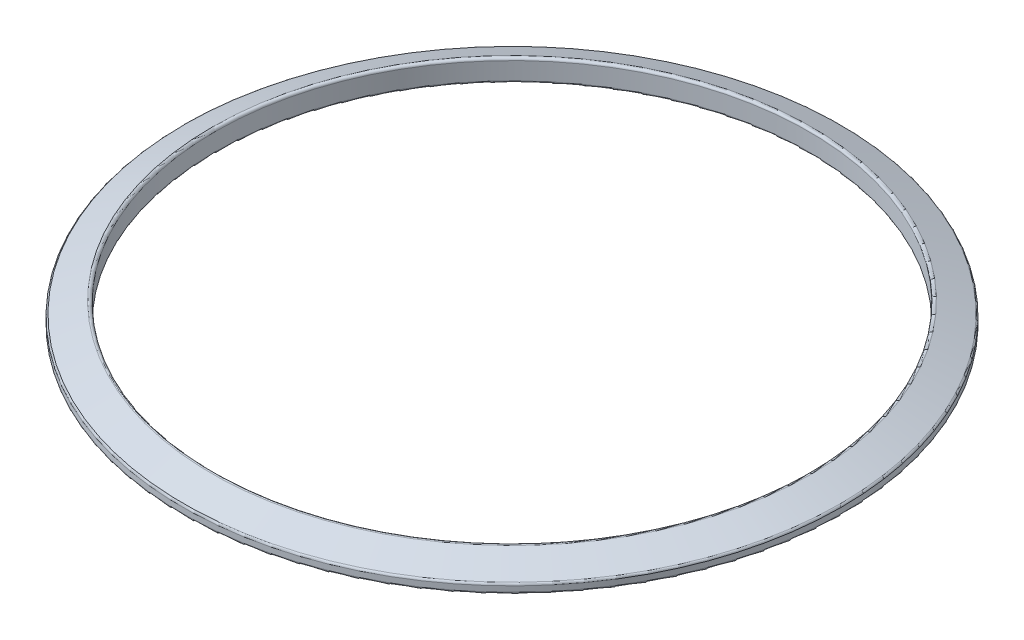
ISO-10303-21;
HEADER;
FILE_DESCRIPTION(('STEP AP214'),'2;1');
FILE_NAME('part.step','',(''),(''),'','','');
FILE_SCHEMA(('AUTOMOTIVE_DESIGN { 1 0 10303 214 1 1 1 1 }'));
ENDSEC;
DATA;
#1=APPLICATION_CONTEXT('core data for automotive mechanical design processes');
#2=APPLICATION_PROTOCOL_DEFINITION('international standard','automotive_design',2000,#1);
#3=PRODUCT_CONTEXT('',#1,'mechanical');
#4=PRODUCT('Part','Part','',(#3));
#5=PRODUCT_RELATED_PRODUCT_CATEGORY('part','',(#4));
#6=PRODUCT_DEFINITION_FORMATION('','',#4);
#7=PRODUCT_DEFINITION_CONTEXT('part definition',#1,'design');
#8=PRODUCT_DEFINITION('design','',#6,#7);
#9=PRODUCT_DEFINITION_SHAPE('','',#8);
#10=(LENGTH_UNIT() NAMED_UNIT(*) SI_UNIT(.MILLI.,.METRE.));
#11=(NAMED_UNIT(*) PLANE_ANGLE_UNIT() SI_UNIT($,.RADIAN.));
#12=(NAMED_UNIT(*) SI_UNIT($,.STERADIAN.) SOLID_ANGLE_UNIT());
#13=UNCERTAINTY_MEASURE_WITH_UNIT(LENGTH_MEASURE(1.E-05),#10,'distance_accuracy_value','');
#14=(GEOMETRIC_REPRESENTATION_CONTEXT(3) GLOBAL_UNCERTAINTY_ASSIGNED_CONTEXT((#13)) GLOBAL_UNIT_ASSIGNED_CONTEXT((#10,
#11,#12)) REPRESENTATION_CONTEXT('',''));
#15=CARTESIAN_POINT('',(0.,0.,0.));
#16=DIRECTION('',(0.,0.,1.));
#17=DIRECTION('',(1.,0.,0.));
#18=AXIS2_PLACEMENT_3D('',#15,#16,#17);
#19=CARTESIAN_POINT('',(0.,0.5,0.));
#20=DIRECTION('',(0.,1.,0.));
#21=DIRECTION('',(-0.999988335662142,0.,-0.0048299626975992));
#22=AXIS2_PLACEMENT_3D('',#19,#20,#21);
#23=TOROIDAL_SURFACE('',#22,64.,0.5);
#24=CARTESIAN_POINT('',(0.,0.,0.));
#25=DIRECTION('',(0.,1.,0.));
#26=DIRECTION('',(-1.,0.,0.));
#27=AXIS2_PLACEMENT_3D('',#24,#25,#26);
#28=CIRCLE('',#27,63.99999999652);
#29=CARTESIAN_POINT('',(63.9992534788971,0.,0.309117612629533));
#30=VERTEX_POINT('',#29);
#31=EDGE_CURVE('E140',#30,#30,#28,.T.);
#32=ORIENTED_EDGE('',*,*,#31,.F.);
#33=CARTESIAN_POINT('',(63.9992534823771,0.5,0.309117612646341));
#34=DIRECTION('',(0.00482996269759908,0.,-0.999988335662142));
#35=DIRECTION('',(0.999988335662142,0.,0.00482996269759908));
#36=AXIS2_PLACEMENT_3D('',#33,#34,#35);
#37=CIRCLE('',#36,0.5);
#38=CARTESIAN_POINT('',(63.499259314546,0.5,0.306702631297541));
#39=VERTEX_POINT('',#38);
#40=EDGE_CURVE('E11',#30,#39,#37,.T.);
#41=ORIENTED_EDGE('',*,*,#40,.T.);
#42=CARTESIAN_POINT('',(0.,0.5,0.));
#43=DIRECTION('',(0.,1.,0.));
#44=DIRECTION('',(1.,0.,0.));
#45=AXIS2_PLACEMENT_3D('',#42,#43,#44);
#46=CIRCLE('',#45,63.5);
#47=CARTESIAN_POINT('',(-63.5,0.5,0.));
#48=VERTEX_POINT('',#47);
#49=EDGE_CURVE('E151',#39,#48,#46,.T.);
#50=ORIENTED_EDGE('',*,*,#49,.T.);
#51=CARTESIAN_POINT('',(0.,0.5,0.));
#52=DIRECTION('',(0.,1.,0.));
#53=DIRECTION('',(1.,0.,0.));
#54=AXIS2_PLACEMENT_3D('',#51,#52,#53);
#55=CIRCLE('',#54,63.5);
#56=EDGE_CURVE('E148',#48,#39,#55,.T.);
#57=ORIENTED_EDGE('',*,*,#56,.T.);
#58=ORIENTED_EDGE('',*,*,#40,.F.);
#59=EDGE_LOOP('',(#32,#41,#50,#57,#58));
#60=FACE_BOUND('',#59,.T.);
#61=ADVANCED_FACE('F17',(#60),#23,.T.);
#62=CARTESIAN_POINT('',(0.,-0.25,0.));
#63=DIRECTION('',(0.,1.,0.));
#64=DIRECTION('',(1.,0.,0.));
#65=AXIS2_PLACEMENT_3D('',#62,#63,#64);
#66=CYLINDRICAL_SURFACE('',#65,63.5);
#67=ORIENTED_EDGE('',*,*,#49,.F.);
#68=ORIENTED_EDGE('',*,*,#56,.F.);
#69=DIRECTION('',(0.,1.,0.));
#70=VECTOR('',#69,1.);
#71=CARTESIAN_POINT('',(-63.5,-0.25,0.));
#72=LINE('',#71,#70);
#73=CARTESIAN_POINT('',(-63.5,4.241730492438,0.));
#74=VERTEX_POINT('',#73);
#75=EDGE_CURVE('E28',#48,#74,#72,.T.);
#76=ORIENTED_EDGE('',*,*,#75,.T.);
#77=CARTESIAN_POINT('',(0.,4.241730492438,0.));
#78=DIRECTION('',(0.,1.,0.));
#79=DIRECTION('',(1.,0.,0.));
#80=AXIS2_PLACEMENT_3D('',#77,#78,#79);
#81=CIRCLE('',#80,63.5);
#82=CARTESIAN_POINT('',(-63.4993346782106,4.241730492438,-0.290680967047425));
#83=VERTEX_POINT('',#82);
#84=EDGE_CURVE('E144',#74,#83,#81,.T.);
#85=ORIENTED_EDGE('',*,*,#84,.T.);
#86=CARTESIAN_POINT('',(0.,4.241730492438,0.));
#87=DIRECTION('',(0.,1.,0.));
#88=DIRECTION('',(1.,0.,0.));
#89=AXIS2_PLACEMENT_3D('',#86,#87,#88);
#90=CIRCLE('',#89,63.5);
#91=EDGE_CURVE('E162',#83,#74,#90,.T.);
#92=ORIENTED_EDGE('',*,*,#91,.T.);
#93=ORIENTED_EDGE('',*,*,#75,.F.);
#94=EDGE_LOOP('',(#67,#68,#76,#85,#92,#93));
#95=FACE_BOUND('',#94,.T.);
#96=ADVANCED_FACE('F175',(#95),#66,.F.);
#97=CARTESIAN_POINT('',(0.,4.241730492438,0.));
#98=DIRECTION('',(0.,1.,0.));
#99=DIRECTION('',(0.999989522491505,0.,0.00457765302436902));
#100=AXIS2_PLACEMENT_3D('',#97,#98,#99);
#101=TOROIDAL_SURFACE('',#100,64.,0.5);
#102=ORIENTED_EDGE('',*,*,#84,.F.);
#103=ORIENTED_EDGE('',*,*,#91,.F.);
#104=CARTESIAN_POINT('',(-63.9993294394563,4.241730492438,-0.29296979355961));
#105=DIRECTION('',(-0.0045776530243689,0.,0.999989522491505));
#106=DIRECTION('',(-0.999989522491505,0.,-0.0045776530243689));
#107=AXIS2_PLACEMENT_3D('',#104,#105,#106);
#108=CIRCLE('',#107,0.5);
#109=CARTESIAN_POINT('',(-64.1962871031191,4.701302974011,-0.293871406851009));
#110=VERTEX_POINT('',#109);
#111=EDGE_CURVE('E159',#83,#110,#108,.T.);
#112=ORIENTED_EDGE('',*,*,#111,.T.);
#113=CARTESIAN_POINT('',(0.,4.701302974011,0.));
#114=DIRECTION('',(0.,1.,0.));
#115=DIRECTION('',(1.,0.,0.));
#116=AXIS2_PLACEMENT_3D('',#113,#114,#115);
#117=CIRCLE('',#116,64.19695972731);
#118=CARTESIAN_POINT('',(64.1969597273105,4.70130297401218,0.));
#119=VERTEX_POINT('',#118);
#120=EDGE_CURVE('E112',#110,#119,#117,.T.);
#121=ORIENTED_EDGE('',*,*,#120,.T.);
#122=CARTESIAN_POINT('',(0.,4.701302974011,0.));
#123=DIRECTION('',(0.,1.,0.));
#124=DIRECTION('',(1.,0.,0.));
#125=AXIS2_PLACEMENT_3D('',#122,#123,#124);
#126=CIRCLE('',#125,64.19695972731);
#127=EDGE_CURVE('E109',#119,#110,#126,.T.);
#128=ORIENTED_EDGE('',*,*,#127,.T.);
#129=ORIENTED_EDGE('',*,*,#111,.F.);
#130=EDGE_LOOP('',(#102,#103,#112,#121,#128,#129));
#131=FACE_BOUND('',#130,.T.);
#132=ADVANCED_FACE('F168',(#131),#101,.T.);
#133=CARTESIAN_POINT('',(0.,3.415588498428,0.));
#134=DIRECTION('',(0.,-1.,0.));
#135=DIRECTION('',(-1.,0.,0.));
#136=AXIS2_PLACEMENT_3D('',#133,#134,#135);
#137=CONICAL_SURFACE('',#136,67.19696017034,1.16590454050978);
#138=CARTESIAN_POINT('',(0.,2.12987439547,0.));
#139=DIRECTION('',(0.,1.,0.));
#140=DIRECTION('',(1.,0.,0.));
#141=AXIS2_PLACEMENT_3D('',#138,#139,#140);
#142=CIRCLE('',#141,70.1969597439);
#143=CARTESIAN_POINT('',(-70.1962954691119,2.12987439547,-0.305384511496303));
#144=VERTEX_POINT('',#143);
#145=CARTESIAN_POINT('',(70.1969597439013,2.12987439547304,0.));
#146=VERTEX_POINT('',#145);
#147=EDGE_CURVE('E117',#144,#146,#142,.T.);
#148=ORIENTED_EDGE('',*,*,#147,.T.);
#149=DIRECTION('',(-0.919145030018045,0.393919298579197,0.));
#150=VECTOR('',#149,1.);
#151=CARTESIAN_POINT('',(67.19696017034,3.415588498428,0.));
#152=LINE('',#151,#150);
#153=EDGE_CURVE('E101',#146,#119,#152,.T.);
#154=ORIENTED_EDGE('',*,*,#153,.T.);
#155=ORIENTED_EDGE('',*,*,#120,.F.);
#156=ORIENTED_EDGE('',*,*,#127,.F.);
#157=ORIENTED_EDGE('',*,*,#153,.F.);
#158=CARTESIAN_POINT('',(0.,2.12987439547,0.));
#159=DIRECTION('',(0.,1.,0.));
#160=DIRECTION('',(1.,0.,0.));
#161=AXIS2_PLACEMENT_3D('',#158,#159,#160);
#162=CIRCLE('',#161,70.1969597439);
#163=EDGE_CURVE('E105',#146,#144,#162,.T.);
#164=ORIENTED_EDGE('',*,*,#163,.T.);
#165=EDGE_LOOP('',(#148,#154,#155,#156,#157,#164));
#166=FACE_BOUND('',#165,.T.);
#167=ADVANCED_FACE('F104',(#166),#137,.T.);
#168=CARTESIAN_POINT('',(0.,1.67030192101,0.));
#169=DIRECTION('',(0.,1.,0.));
#170=DIRECTION('',(0.999990536986352,0.,0.00435039512552179));
#171=AXIS2_PLACEMENT_3D('',#168,#169,#170);
#172=TOROIDAL_SURFACE('',#171,70.,0.5);
#173=ORIENTED_EDGE('',*,*,#147,.F.);
#174=CARTESIAN_POINT('',(-69.9993375890446,1.67030192101,-0.304527658786517));
#175=DIRECTION('',(-0.00435039512552167,0.,0.999990536986352));
#176=DIRECTION('',(-0.999990536986352,0.,-0.00435039512552167));
#177=AXIS2_PLACEMENT_3D('',#174,#175,#176);
#178=CIRCLE('',#177,0.5);
#179=CARTESIAN_POINT('',(-70.4993328575378,1.670301921029,-0.306702856349277));
#180=VERTEX_POINT('',#179);
#181=EDGE_CURVE('E119',#144,#180,#178,.T.);
#182=ORIENTED_EDGE('',*,*,#181,.T.);
#183=CARTESIAN_POINT('',(0.,1.670301921029,0.));
#184=DIRECTION('',(0.,1.,0.));
#185=DIRECTION('',(1.,0.,0.));
#186=AXIS2_PLACEMENT_3D('',#183,#184,#185);
#187=CIRCLE('',#186,70.5);
#188=CARTESIAN_POINT('',(-70.5,1.670301921029,0.));
#189=VERTEX_POINT('',#188);
#190=EDGE_CURVE('E21',#180,#189,#187,.T.);
#191=ORIENTED_EDGE('',*,*,#190,.T.);
#192=CARTESIAN_POINT('',(0.,1.670301921029,0.));
#193=DIRECTION('',(0.,1.,0.));
#194=DIRECTION('',(1.,0.,0.));
#195=AXIS2_PLACEMENT_3D('',#192,#193,#194);
#196=CIRCLE('',#195,70.5);
#197=EDGE_CURVE('E133',#189,#180,#196,.T.);
#198=ORIENTED_EDGE('',*,*,#197,.T.);
#199=ORIENTED_EDGE('',*,*,#181,.F.);
#200=ORIENTED_EDGE('',*,*,#163,.F.);
#201=EDGE_LOOP('',(#173,#182,#191,#198,#199,#200));
#202=FACE_BOUND('',#201,.T.);
#203=ADVANCED_FACE('F116',(#202),#172,.T.);
#204=CARTESIAN_POINT('',(0.,-0.25,0.));
#205=DIRECTION('',(0.,1.,0.));
#206=DIRECTION('',(1.,0.,0.));
#207=AXIS2_PLACEMENT_3D('',#204,#205,#206);
#208=CYLINDRICAL_SURFACE('',#207,70.5);
#209=ORIENTED_EDGE('',*,*,#197,.F.);
#210=DIRECTION('',(0.,-1.,0.));
#211=VECTOR('',#210,1.);
#212=CARTESIAN_POINT('',(-70.5,-0.25,0.));
#213=LINE('',#212,#211);
#214=CARTESIAN_POINT('',(-70.5,0.5,0.));
#215=VERTEX_POINT('',#214);
#216=EDGE_CURVE('E91',#189,#215,#213,.T.);
#217=ORIENTED_EDGE('',*,*,#216,.T.);
#218=CARTESIAN_POINT('',(0.,0.5,0.));
#219=DIRECTION('',(0.,1.,0.));
#220=DIRECTION('',(1.,0.,0.));
#221=AXIS2_PLACEMENT_3D('',#218,#219,#220);
#222=CIRCLE('',#221,70.5);
#223=CARTESIAN_POINT('',(-70.4992669553259,0.5,-0.321494574904278));
#224=VERTEX_POINT('',#223);
#225=EDGE_CURVE('E146',#215,#224,#222,.T.);
#226=ORIENTED_EDGE('',*,*,#225,.T.);
#227=CARTESIAN_POINT('',(0.,0.5,0.));
#228=DIRECTION('',(0.,1.,0.));
#229=DIRECTION('',(1.,0.,0.));
#230=AXIS2_PLACEMENT_3D('',#227,#228,#229);
#231=CIRCLE('',#230,70.5);
#232=EDGE_CURVE('E154',#224,#215,#231,.T.);
#233=ORIENTED_EDGE('',*,*,#232,.T.);
#234=ORIENTED_EDGE('',*,*,#216,.F.);
#235=ORIENTED_EDGE('',*,*,#190,.F.);
#236=EDGE_LOOP('',(#209,#217,#226,#233,#234,#235));
#237=FACE_BOUND('',#236,.T.);
#238=ADVANCED_FACE('F190',(#237),#208,.T.);
#239=CARTESIAN_POINT('',(0.,0.5,0.));
#240=DIRECTION('',(0.,1.,0.));
#241=DIRECTION('',(0.999989602203204,0.,0.00456020673623102));
#242=AXIS2_PLACEMENT_3D('',#239,#240,#241);
#243=TOROIDAL_SURFACE('',#242,70.,0.5);
#244=ORIENTED_EDGE('',*,*,#225,.F.);
#245=ORIENTED_EDGE('',*,*,#232,.F.);
#246=CARTESIAN_POINT('',(-69.9992721542243,0.5,-0.319214471536163));
#247=DIRECTION('',(-0.0045602067362309,0.,0.999989602203204));
#248=DIRECTION('',(-0.999989602203204,0.,-0.0045602067362309));
#249=AXIS2_PLACEMENT_3D('',#246,#247,#248);
#250=CIRCLE('',#249,0.5);
#251=CARTESIAN_POINT('',(-69.999272281103,0.,-0.319214472114762));
#252=VERTEX_POINT('',#251);
#253=EDGE_CURVE('E135',#224,#252,#250,.T.);
#254=ORIENTED_EDGE('',*,*,#253,.T.);
#255=CARTESIAN_POINT('',(0.,0.,0.));
#256=DIRECTION('',(0.,1.,0.));
#257=DIRECTION('',(1.,0.,0.));
#258=AXIS2_PLACEMENT_3D('',#255,#256,#257);
#259=CIRCLE('',#258,70.00000012688);
#260=EDGE_CURVE('E137',#252,#252,#259,.T.);
#261=ORIENTED_EDGE('',*,*,#260,.T.);
#262=ORIENTED_EDGE('',*,*,#253,.F.);
#263=EDGE_LOOP('',(#244,#245,#254,#261,#262));
#264=FACE_BOUND('',#263,.T.);
#265=ADVANCED_FACE('F193',(#264),#243,.T.);
#266=CARTESIAN_POINT('',(0.,0.,0.));
#267=DIRECTION('',(0.,1.,0.));
#268=DIRECTION('',(1.,0.,0.));
#269=AXIS2_PLACEMENT_3D('',#266,#267,#268);
#270=PLANE('',#269);
#271=ORIENTED_EDGE('',*,*,#31,.T.);
#272=EDGE_LOOP('',(#271));
#273=FACE_BOUND('',#272,.T.);
#274=ORIENTED_EDGE('',*,*,#260,.F.);
#275=EDGE_LOOP('',(#274));
#276=FACE_BOUND('',#275,.T.);
#277=ADVANCED_FACE('F19',(#273,#276),#270,.F.);
#278=CLOSED_SHELL('',(#61,#96,#132,#167,#203,#238,#265,#277));
#279=MANIFOLD_SOLID_BREP('B1',#278);
#280=ADVANCED_BREP_SHAPE_REPRESENTATION('',(#18,#279),#14);
#281=SHAPE_DEFINITION_REPRESENTATION(#9,#280);
ENDSEC;
END-ISO-10303-21;
